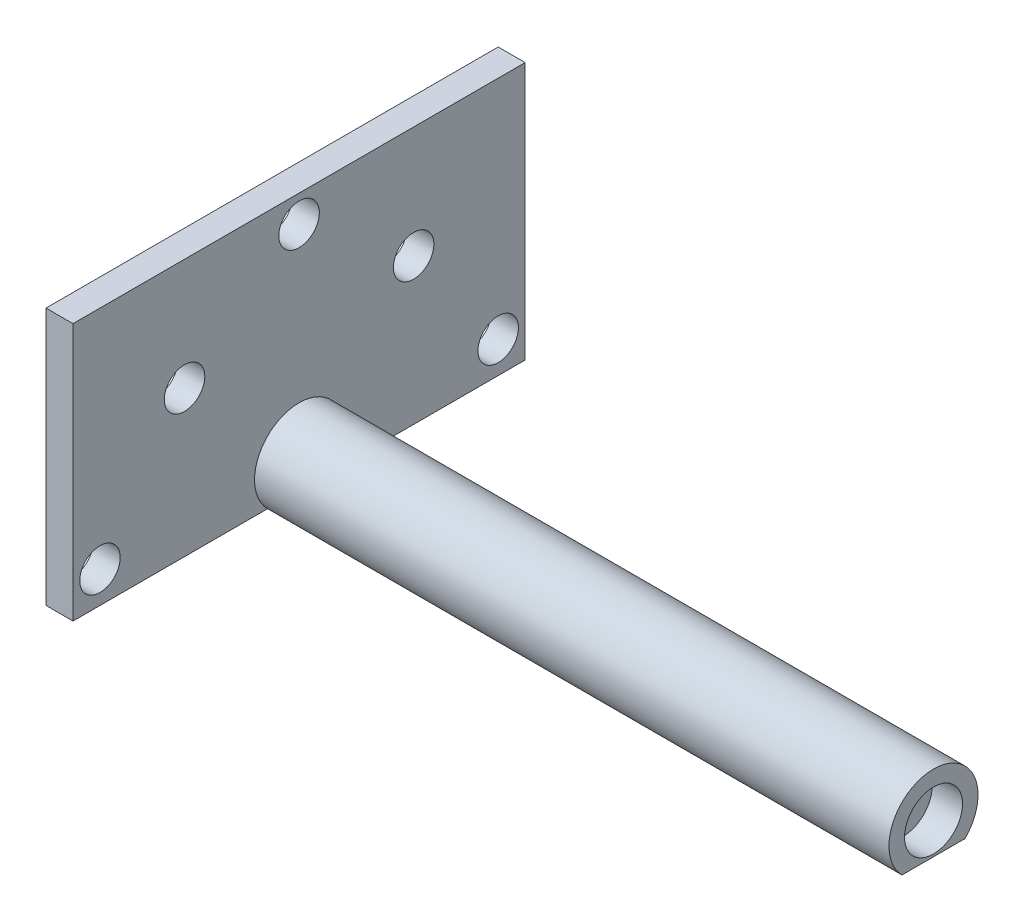
ISO-10303-21;
HEADER;
FILE_DESCRIPTION(('STEP AP214'),'2;1');
FILE_NAME('part.step','',(''),(''),'','','');
FILE_SCHEMA(('AUTOMOTIVE_DESIGN { 1 0 10303 214 1 1 1 1 }'));
ENDSEC;
DATA;
#1=APPLICATION_CONTEXT('core data for automotive mechanical design processes');
#2=APPLICATION_PROTOCOL_DEFINITION('international standard','automotive_design',2000,#1);
#3=PRODUCT_CONTEXT('',#1,'mechanical');
#4=PRODUCT('Part','Part','',(#3));
#5=PRODUCT_RELATED_PRODUCT_CATEGORY('part','',(#4));
#6=PRODUCT_DEFINITION_FORMATION('','',#4);
#7=PRODUCT_DEFINITION_CONTEXT('part definition',#1,'design');
#8=PRODUCT_DEFINITION('design','',#6,#7);
#9=PRODUCT_DEFINITION_SHAPE('','',#8);
#10=(LENGTH_UNIT() NAMED_UNIT(*) SI_UNIT(.MILLI.,.METRE.));
#11=(NAMED_UNIT(*) PLANE_ANGLE_UNIT() SI_UNIT($,.RADIAN.));
#12=(NAMED_UNIT(*) SI_UNIT($,.STERADIAN.) SOLID_ANGLE_UNIT());
#13=UNCERTAINTY_MEASURE_WITH_UNIT(LENGTH_MEASURE(1.E-05),#10,'distance_accuracy_value','');
#14=(GEOMETRIC_REPRESENTATION_CONTEXT(3) GLOBAL_UNCERTAINTY_ASSIGNED_CONTEXT((#13)) GLOBAL_UNIT_ASSIGNED_CONTEXT((#10,
#11,#12)) REPRESENTATION_CONTEXT('',''));
#15=CARTESIAN_POINT('',(0.,0.,0.));
#16=DIRECTION('',(0.,0.,1.));
#17=DIRECTION('',(1.,0.,0.));
#18=AXIS2_PLACEMENT_3D('',#15,#16,#17);
#19=CARTESIAN_POINT('',(2.,0.,16.75));
#20=DIRECTION('',(0.,0.,1.));
#21=DIRECTION('',(1.,0.,0.));
#22=AXIS2_PLACEMENT_3D('',#19,#20,#21);
#23=PLANE('',#22);
#24=DIRECTION('',(0.,1.,0.));
#25=VECTOR('',#24,1.);
#26=CARTESIAN_POINT('',(0.,0.,16.75));
#27=LINE('',#26,#25);
#28=CARTESIAN_POINT('',(0.,-2.33345237791561,16.75));
#29=VERTEX_POINT('',#28);
#30=CARTESIAN_POINT('',(0.,16.75,16.75));
#31=VERTEX_POINT('',#30);
#32=EDGE_CURVE('E114',#29,#31,#27,.T.);
#33=ORIENTED_EDGE('',*,*,#32,.F.);
#34=DIRECTION('',(-1.,0.,0.));
#35=VECTOR('',#34,1.);
#36=CARTESIAN_POINT('',(2.,-2.33345237791561,16.75));
#37=LINE('',#36,#35);
#38=CARTESIAN_POINT('',(2.,-2.33345237791561,16.75));
#39=VERTEX_POINT('',#38);
#40=EDGE_CURVE('E11',#39,#29,#37,.T.);
#41=ORIENTED_EDGE('',*,*,#40,.F.);
#42=DIRECTION('',(0.,1.,0.));
#43=VECTOR('',#42,1.);
#44=CARTESIAN_POINT('',(2.,0.,16.75));
#45=LINE('',#44,#43);
#46=CARTESIAN_POINT('',(2.,16.75,16.75));
#47=VERTEX_POINT('',#46);
#48=EDGE_CURVE('E118',#39,#47,#45,.T.);
#49=ORIENTED_EDGE('',*,*,#48,.T.);
#50=DIRECTION('',(-1.,0.,0.));
#51=VECTOR('',#50,1.);
#52=CARTESIAN_POINT('',(2.,16.75,16.75));
#53=LINE('',#52,#51);
#54=EDGE_CURVE('E64',#47,#31,#53,.T.);
#55=ORIENTED_EDGE('',*,*,#54,.T.);
#56=EDGE_LOOP('',(#33,#41,#49,#55));
#57=FACE_BOUND('',#56,.T.);
#58=ADVANCED_FACE('F41',(#57),#23,.T.);
#59=CARTESIAN_POINT('',(2.,-2.33345237791561,0.));
#60=DIRECTION('',(0.,1.,0.));
#61=DIRECTION('',(0.,0.,1.));
#62=AXIS2_PLACEMENT_3D('',#59,#60,#61);
#63=PLANE('',#62);
#64=DIRECTION('',(0.,0.,-1.));
#65=VECTOR('',#64,1.);
#66=CARTESIAN_POINT('',(0.,-2.33345237791561,0.));
#67=LINE('',#66,#65);
#68=CARTESIAN_POINT('',(0.,-2.33345237791561,-16.75));
#69=VERTEX_POINT('',#68);
#70=EDGE_CURVE('E144',#29,#69,#67,.T.);
#71=ORIENTED_EDGE('',*,*,#70,.T.);
#72=DIRECTION('',(-1.,0.,0.));
#73=VECTOR('',#72,1.);
#74=CARTESIAN_POINT('',(2.,-2.33345237791561,-16.75));
#75=LINE('',#74,#73);
#76=CARTESIAN_POINT('',(2.,-2.33345237791561,-16.75));
#77=VERTEX_POINT('',#76);
#78=EDGE_CURVE('E48',#77,#69,#75,.T.);
#79=ORIENTED_EDGE('',*,*,#78,.F.);
#80=DIRECTION('',(0.,0.,-1.));
#81=VECTOR('',#80,1.);
#82=CARTESIAN_POINT('',(2.,-2.33345237791561,0.));
#83=LINE('',#82,#81);
#84=CARTESIAN_POINT('',(2.,-2.33345237791561,-2.33345237791561));
#85=VERTEX_POINT('',#84);
#86=EDGE_CURVE('E111',#85,#77,#83,.T.);
#87=ORIENTED_EDGE('',*,*,#86,.F.);
#88=DIRECTION('',(-1.,0.,0.));
#89=VECTOR('',#88,1.);
#90=CARTESIAN_POINT('',(49.,-2.33345237791561,-2.33345237791561));
#91=LINE('',#90,#89);
#92=CARTESIAN_POINT('',(49.,-2.33345237791561,-2.33345237791561));
#93=VERTEX_POINT('',#92);
#94=EDGE_CURVE('E55',#93,#85,#91,.T.);
#95=ORIENTED_EDGE('',*,*,#94,.F.);
#96=DIRECTION('',(0.,0.,-1.));
#97=VECTOR('',#96,1.);
#98=CARTESIAN_POINT('',(49.,-2.33345237791561,0.));
#99=LINE('',#98,#97);
#100=CARTESIAN_POINT('',(49.,-2.33345237791561,2.33345237791561));
#101=VERTEX_POINT('',#100);
#102=EDGE_CURVE('E102',#101,#93,#99,.T.);
#103=ORIENTED_EDGE('',*,*,#102,.F.);
#104=DIRECTION('',(-1.,0.,0.));
#105=VECTOR('',#104,1.);
#106=CARTESIAN_POINT('',(49.,-2.33345237791561,2.33345237791561));
#107=LINE('',#106,#105);
#108=CARTESIAN_POINT('',(2.,-2.33345237791561,2.33345237791561));
#109=VERTEX_POINT('',#108);
#110=EDGE_CURVE('E99',#101,#109,#107,.T.);
#111=ORIENTED_EDGE('',*,*,#110,.T.);
#112=EDGE_CURVE('E121',#39,#109,#83,.T.);
#113=ORIENTED_EDGE('',*,*,#112,.F.);
#114=ORIENTED_EDGE('',*,*,#40,.T.);
#115=EDGE_LOOP('',(#71,#79,#87,#95,#103,#111,#113,#114));
#116=FACE_BOUND('',#115,.T.);
#117=ADVANCED_FACE('F109',(#116),#63,.F.);
#118=CARTESIAN_POINT('',(2.,0.,-16.75));
#119=DIRECTION('',(0.,0.,1.));
#120=DIRECTION('',(0.,-1.,0.));
#121=AXIS2_PLACEMENT_3D('',#118,#119,#120);
#122=PLANE('',#121);
#123=DIRECTION('',(0.,1.,0.));
#124=VECTOR('',#123,1.);
#125=CARTESIAN_POINT('',(0.,0.,-16.75));
#126=LINE('',#125,#124);
#127=CARTESIAN_POINT('',(0.,16.75,-16.75));
#128=VERTEX_POINT('',#127);
#129=EDGE_CURVE('E146',#69,#128,#126,.T.);
#130=ORIENTED_EDGE('',*,*,#129,.T.);
#131=DIRECTION('',(-1.,0.,0.));
#132=VECTOR('',#131,1.);
#133=CARTESIAN_POINT('',(2.,16.75,-16.75));
#134=LINE('',#133,#132);
#135=CARTESIAN_POINT('',(2.,16.75,-16.75));
#136=VERTEX_POINT('',#135);
#137=EDGE_CURVE('E167',#136,#128,#134,.T.);
#138=ORIENTED_EDGE('',*,*,#137,.F.);
#139=DIRECTION('',(0.,1.,0.));
#140=VECTOR('',#139,1.);
#141=CARTESIAN_POINT('',(2.,0.,-16.75));
#142=LINE('',#141,#140);
#143=EDGE_CURVE('E124',#77,#136,#142,.T.);
#144=ORIENTED_EDGE('',*,*,#143,.F.);
#145=ORIENTED_EDGE('',*,*,#78,.T.);
#146=EDGE_LOOP('',(#130,#138,#144,#145));
#147=FACE_BOUND('',#146,.T.);
#148=ADVANCED_FACE('F172',(#147),#122,.F.);
#149=CARTESIAN_POINT('',(2.,0.,-14.75));
#150=DIRECTION('',(-1.,0.,0.));
#151=DIRECTION('',(0.,0.,1.));
#152=AXIS2_PLACEMENT_3D('',#149,#150,#151);
#153=CYLINDRICAL_SURFACE('',#152,1.5);
#154=CARTESIAN_POINT('',(2.,0.,-14.75));
#155=DIRECTION('',(1.,0.,0.));
#156=DIRECTION('',(0.,0.,-1.));
#157=AXIS2_PLACEMENT_3D('',#154,#155,#156);
#158=CIRCLE('',#157,1.5);
#159=CARTESIAN_POINT('',(2.,0.,-16.25));
#160=VERTEX_POINT('',#159);
#161=EDGE_CURVE('E137',#160,#160,#158,.T.);
#162=ORIENTED_EDGE('',*,*,#161,.T.);
#163=EDGE_LOOP('',(#162));
#164=FACE_BOUND('',#163,.T.);
#165=CARTESIAN_POINT('',(0.,0.,-14.75));
#166=DIRECTION('',(1.,0.,0.));
#167=DIRECTION('',(0.,0.,-1.));
#168=AXIS2_PLACEMENT_3D('',#165,#166,#167);
#169=CIRCLE('',#168,1.5);
#170=CARTESIAN_POINT('',(0.,0.,-16.25));
#171=VERTEX_POINT('',#170);
#172=EDGE_CURVE('E161',#171,#171,#169,.T.);
#173=ORIENTED_EDGE('',*,*,#172,.F.);
#174=EDGE_LOOP('',(#173));
#175=FACE_BOUND('',#174,.T.);
#176=ADVANCED_FACE('F193',(#164,#175),#153,.F.);
#177=CARTESIAN_POINT('',(2.,0.,14.75));
#178=DIRECTION('',(-1.,0.,0.));
#179=DIRECTION('',(0.,0.,1.));
#180=AXIS2_PLACEMENT_3D('',#177,#178,#179);
#181=CYLINDRICAL_SURFACE('',#180,1.5);
#182=CARTESIAN_POINT('',(2.,0.,14.75));
#183=DIRECTION('',(1.,0.,0.));
#184=DIRECTION('',(0.,0.,-1.));
#185=AXIS2_PLACEMENT_3D('',#182,#183,#184);
#186=CIRCLE('',#185,1.5);
#187=CARTESIAN_POINT('',(2.,0.,13.25));
#188=VERTEX_POINT('',#187);
#189=EDGE_CURVE('E134',#188,#188,#186,.T.);
#190=ORIENTED_EDGE('',*,*,#189,.T.);
#191=EDGE_LOOP('',(#190));
#192=FACE_BOUND('',#191,.T.);
#193=CARTESIAN_POINT('',(0.,0.,14.75));
#194=DIRECTION('',(1.,0.,0.));
#195=DIRECTION('',(0.,0.,-1.));
#196=AXIS2_PLACEMENT_3D('',#193,#194,#195);
#197=CIRCLE('',#196,1.5);
#198=CARTESIAN_POINT('',(0.,0.,13.25));
#199=VERTEX_POINT('',#198);
#200=EDGE_CURVE('E158',#199,#199,#197,.T.);
#201=ORIENTED_EDGE('',*,*,#200,.F.);
#202=EDGE_LOOP('',(#201));
#203=FACE_BOUND('',#202,.T.);
#204=ADVANCED_FACE('F206',(#192,#203),#181,.F.);
#205=CARTESIAN_POINT('',(2.,8.48528137423857,8.48528137423857));
#206=DIRECTION('',(-1.,0.,0.));
#207=DIRECTION('',(0.,0.,1.));
#208=AXIS2_PLACEMENT_3D('',#205,#206,#207);
#209=CYLINDRICAL_SURFACE('',#208,1.5);
#210=CARTESIAN_POINT('',(2.,8.48528137423857,8.48528137423857));
#211=DIRECTION('',(1.,0.,0.));
#212=DIRECTION('',(0.,0.,-1.));
#213=AXIS2_PLACEMENT_3D('',#210,#211,#212);
#214=CIRCLE('',#213,1.5);
#215=CARTESIAN_POINT('',(2.,8.48528137423857,6.98528137423857));
#216=VERTEX_POINT('',#215);
#217=EDGE_CURVE('E131',#216,#216,#214,.T.);
#218=ORIENTED_EDGE('',*,*,#217,.T.);
#219=EDGE_LOOP('',(#218));
#220=FACE_BOUND('',#219,.T.);
#221=CARTESIAN_POINT('',(0.,8.48528137423857,8.48528137423857));
#222=DIRECTION('',(1.,0.,0.));
#223=DIRECTION('',(0.,0.,-1.));
#224=AXIS2_PLACEMENT_3D('',#221,#222,#223);
#225=CIRCLE('',#224,1.5);
#226=CARTESIAN_POINT('',(0.,8.48528137423857,6.98528137423857));
#227=VERTEX_POINT('',#226);
#228=EDGE_CURVE('E155',#227,#227,#225,.T.);
#229=ORIENTED_EDGE('',*,*,#228,.F.);
#230=EDGE_LOOP('',(#229));
#231=FACE_BOUND('',#230,.T.);
#232=ADVANCED_FACE('F202',(#220,#231),#209,.F.);
#233=CARTESIAN_POINT('',(2.,8.48528137423854,-8.4852813742386));
#234=DIRECTION('',(-1.,0.,0.));
#235=DIRECTION('',(0.,0.,1.));
#236=AXIS2_PLACEMENT_3D('',#233,#234,#235);
#237=CYLINDRICAL_SURFACE('',#236,1.5);
#238=CARTESIAN_POINT('',(2.,8.48528137423854,-8.4852813742386));
#239=DIRECTION('',(1.,0.,0.));
#240=DIRECTION('',(0.,0.,-1.));
#241=AXIS2_PLACEMENT_3D('',#238,#239,#240);
#242=CIRCLE('',#241,1.5);
#243=CARTESIAN_POINT('',(2.,8.48528137423854,-9.9852813742386));
#244=VERTEX_POINT('',#243);
#245=EDGE_CURVE('E128',#244,#244,#242,.T.);
#246=ORIENTED_EDGE('',*,*,#245,.T.);
#247=EDGE_LOOP('',(#246));
#248=FACE_BOUND('',#247,.T.);
#249=CARTESIAN_POINT('',(0.,8.48528137423854,-8.4852813742386));
#250=DIRECTION('',(1.,0.,0.));
#251=DIRECTION('',(0.,0.,-1.));
#252=AXIS2_PLACEMENT_3D('',#249,#250,#251);
#253=CIRCLE('',#252,1.5);
#254=CARTESIAN_POINT('',(0.,8.48528137423854,-9.9852813742386));
#255=VERTEX_POINT('',#254);
#256=EDGE_CURVE('E152',#255,#255,#253,.T.);
#257=ORIENTED_EDGE('',*,*,#256,.F.);
#258=EDGE_LOOP('',(#257));
#259=FACE_BOUND('',#258,.T.);
#260=ADVANCED_FACE('F199',(#248,#259),#237,.F.);
#261=CARTESIAN_POINT('',(2.,16.75,0.));
#262=DIRECTION('',(0.,1.,0.));
#263=DIRECTION('',(0.,0.,1.));
#264=AXIS2_PLACEMENT_3D('',#261,#262,#263);
#265=PLANE('',#264);
#266=DIRECTION('',(0.,0.,-1.));
#267=VECTOR('',#266,1.);
#268=CARTESIAN_POINT('',(0.,16.75,0.));
#269=LINE('',#268,#267);
#270=EDGE_CURVE('E149',#31,#128,#269,.T.);
#271=ORIENTED_EDGE('',*,*,#270,.F.);
#272=ORIENTED_EDGE('',*,*,#54,.F.);
#273=DIRECTION('',(0.,0.,-1.));
#274=VECTOR('',#273,1.);
#275=CARTESIAN_POINT('',(2.,16.75,0.));
#276=LINE('',#275,#274);
#277=EDGE_CURVE('E126',#47,#136,#276,.T.);
#278=ORIENTED_EDGE('',*,*,#277,.T.);
#279=ORIENTED_EDGE('',*,*,#137,.T.);
#280=EDGE_LOOP('',(#271,#272,#278,#279));
#281=FACE_BOUND('',#280,.T.);
#282=ADVANCED_FACE('F178',(#281),#265,.T.);
#283=CARTESIAN_POINT('',(2.,14.75,0.));
#284=DIRECTION('',(-1.,0.,0.));
#285=DIRECTION('',(0.,0.,1.));
#286=AXIS2_PLACEMENT_3D('',#283,#284,#285);
#287=CYLINDRICAL_SURFACE('',#286,1.5);
#288=CARTESIAN_POINT('',(2.,14.75,0.));
#289=DIRECTION('',(1.,0.,0.));
#290=DIRECTION('',(0.,0.,-1.));
#291=AXIS2_PLACEMENT_3D('',#288,#289,#290);
#292=CIRCLE('',#291,1.5);
#293=CARTESIAN_POINT('',(2.,14.75,-1.5));
#294=VERTEX_POINT('',#293);
#295=EDGE_CURVE('E140',#294,#294,#292,.T.);
#296=ORIENTED_EDGE('',*,*,#295,.T.);
#297=EDGE_LOOP('',(#296));
#298=FACE_BOUND('',#297,.T.);
#299=CARTESIAN_POINT('',(0.,14.75,0.));
#300=DIRECTION('',(1.,0.,0.));
#301=DIRECTION('',(0.,0.,-1.));
#302=AXIS2_PLACEMENT_3D('',#299,#300,#301);
#303=CIRCLE('',#302,1.5);
#304=CARTESIAN_POINT('',(0.,14.75,-1.5));
#305=VERTEX_POINT('',#304);
#306=EDGE_CURVE('E120',#305,#305,#303,.T.);
#307=ORIENTED_EDGE('',*,*,#306,.F.);
#308=EDGE_LOOP('',(#307));
#309=FACE_BOUND('',#308,.T.);
#310=ADVANCED_FACE('F198',(#298,#309),#287,.F.);
#311=CARTESIAN_POINT('',(2.,0.,0.));
#312=DIRECTION('',(1.,0.,0.));
#313=DIRECTION('',(0.,0.,-1.));
#314=AXIS2_PLACEMENT_3D('',#311,#312,#313);
#315=PLANE('',#314);
#316=ORIENTED_EDGE('',*,*,#112,.T.);
#317=CARTESIAN_POINT('',(2.,0.,0.));
#318=DIRECTION('',(1.,0.,0.));
#319=DIRECTION('',(0.,0.,-1.));
#320=AXIS2_PLACEMENT_3D('',#317,#318,#319);
#321=CIRCLE('',#320,3.3);
#322=EDGE_CURVE('E112',#109,#85,#321,.F.);
#323=ORIENTED_EDGE('',*,*,#322,.T.);
#324=ORIENTED_EDGE('',*,*,#86,.T.);
#325=ORIENTED_EDGE('',*,*,#143,.T.);
#326=ORIENTED_EDGE('',*,*,#277,.F.);
#327=ORIENTED_EDGE('',*,*,#48,.F.);
#328=EDGE_LOOP('',(#316,#323,#324,#325,#326,#327));
#329=FACE_BOUND('',#328,.T.);
#330=ORIENTED_EDGE('',*,*,#245,.F.);
#331=EDGE_LOOP('',(#330));
#332=FACE_BOUND('',#331,.T.);
#333=ORIENTED_EDGE('',*,*,#217,.F.);
#334=EDGE_LOOP('',(#333));
#335=FACE_BOUND('',#334,.T.);
#336=ORIENTED_EDGE('',*,*,#189,.F.);
#337=EDGE_LOOP('',(#336));
#338=FACE_BOUND('',#337,.T.);
#339=ORIENTED_EDGE('',*,*,#161,.F.);
#340=EDGE_LOOP('',(#339));
#341=FACE_BOUND('',#340,.T.);
#342=ORIENTED_EDGE('',*,*,#295,.F.);
#343=EDGE_LOOP('',(#342));
#344=FACE_BOUND('',#343,.T.);
#345=ADVANCED_FACE('F182',(#329,#332,#335,#338,#341,#344),#315,.T.);
#346=CARTESIAN_POINT('',(0.,0.,0.));
#347=DIRECTION('',(1.,0.,0.));
#348=DIRECTION('',(0.,0.,-1.));
#349=AXIS2_PLACEMENT_3D('',#346,#347,#348);
#350=PLANE('',#349);
#351=ORIENTED_EDGE('',*,*,#129,.F.);
#352=ORIENTED_EDGE('',*,*,#70,.F.);
#353=ORIENTED_EDGE('',*,*,#32,.T.);
#354=ORIENTED_EDGE('',*,*,#270,.T.);
#355=EDGE_LOOP('',(#351,#352,#353,#354));
#356=FACE_BOUND('',#355,.T.);
#357=ORIENTED_EDGE('',*,*,#256,.T.);
#358=EDGE_LOOP('',(#357));
#359=FACE_BOUND('',#358,.T.);
#360=ORIENTED_EDGE('',*,*,#228,.T.);
#361=EDGE_LOOP('',(#360));
#362=FACE_BOUND('',#361,.T.);
#363=ORIENTED_EDGE('',*,*,#200,.T.);
#364=EDGE_LOOP('',(#363));
#365=FACE_BOUND('',#364,.T.);
#366=ORIENTED_EDGE('',*,*,#172,.T.);
#367=EDGE_LOOP('',(#366));
#368=FACE_BOUND('',#367,.T.);
#369=ORIENTED_EDGE('',*,*,#306,.T.);
#370=EDGE_LOOP('',(#369));
#371=FACE_BOUND('',#370,.T.);
#372=ADVANCED_FACE('F176',(#356,#359,#362,#365,#368,#371),#350,.F.);
#373=CARTESIAN_POINT('',(49.,0.,0.));
#374=DIRECTION('',(-1.,0.,0.));
#375=DIRECTION('',(0.,0.,1.));
#376=AXIS2_PLACEMENT_3D('',#373,#374,#375);
#377=CYLINDRICAL_SURFACE('',#376,3.3);
#378=ORIENTED_EDGE('',*,*,#322,.F.);
#379=ORIENTED_EDGE('',*,*,#110,.F.);
#380=CARTESIAN_POINT('',(49.,0.,0.));
#381=DIRECTION('',(1.,0.,0.));
#382=DIRECTION('',(0.,0.,-1.));
#383=AXIS2_PLACEMENT_3D('',#380,#381,#382);
#384=CIRCLE('',#383,3.3);
#385=EDGE_CURVE('E95',#93,#101,#384,.T.);
#386=ORIENTED_EDGE('',*,*,#385,.F.);
#387=ORIENTED_EDGE('',*,*,#94,.T.);
#388=EDGE_LOOP('',(#378,#379,#386,#387));
#389=FACE_BOUND('',#388,.T.);
#390=ADVANCED_FACE('F97',(#389),#377,.T.);
#391=CARTESIAN_POINT('',(49.,0.,0.));
#392=DIRECTION('',(1.,0.,0.));
#393=DIRECTION('',(0.,0.,-1.));
#394=AXIS2_PLACEMENT_3D('',#391,#392,#393);
#395=PLANE('',#394);
#396=CARTESIAN_POINT('',(49.,0.,0.));
#397=DIRECTION('',(1.,0.,0.));
#398=DIRECTION('',(0.,0.,-1.));
#399=AXIS2_PLACEMENT_3D('',#396,#397,#398);
#400=CIRCLE('',#399,2.15);
#401=CARTESIAN_POINT('',(49.,0.,-2.15));
#402=VERTEX_POINT('',#401);
#403=EDGE_CURVE('E235',#402,#402,#400,.T.);
#404=ORIENTED_EDGE('',*,*,#403,.F.);
#405=EDGE_LOOP('',(#404));
#406=FACE_BOUND('',#405,.T.);
#407=ORIENTED_EDGE('',*,*,#102,.T.);
#408=ORIENTED_EDGE('',*,*,#385,.T.);
#409=EDGE_LOOP('',(#407,#408));
#410=FACE_BOUND('',#409,.T.);
#411=ADVANCED_FACE('F104',(#406,#410),#395,.T.);
#412=CARTESIAN_POINT('',(46.75,0.,0.));
#413=DIRECTION('',(1.,0.,0.));
#414=DIRECTION('',(0.,0.,-1.));
#415=AXIS2_PLACEMENT_3D('',#412,#413,#414);
#416=CYLINDRICAL_SURFACE('',#415,2.15);
#417=CARTESIAN_POINT('',(46.75,0.,0.));
#418=DIRECTION('',(1.,0.,0.));
#419=DIRECTION('',(0.,0.,-1.));
#420=AXIS2_PLACEMENT_3D('',#417,#418,#419);
#421=CIRCLE('',#420,2.15);
#422=CARTESIAN_POINT('',(46.75,0.,-2.15));
#423=VERTEX_POINT('',#422);
#424=EDGE_CURVE('E106',#423,#423,#421,.T.);
#425=ORIENTED_EDGE('',*,*,#424,.F.);
#426=EDGE_LOOP('',(#425));
#427=FACE_BOUND('',#426,.T.);
#428=ORIENTED_EDGE('',*,*,#403,.T.);
#429=EDGE_LOOP('',(#428));
#430=FACE_BOUND('',#429,.T.);
#431=ADVANCED_FACE('F223',(#427,#430),#416,.F.);
#432=CARTESIAN_POINT('',(46.75,0.,0.));
#433=DIRECTION('',(1.,0.,0.));
#434=DIRECTION('',(0.,0.,-1.));
#435=AXIS2_PLACEMENT_3D('',#432,#433,#434);
#436=PLANE('',#435);
#437=ORIENTED_EDGE('',*,*,#424,.T.);
#438=EDGE_LOOP('',(#437));
#439=FACE_BOUND('',#438,.T.);
#440=ADVANCED_FACE('F227',(#439),#436,.T.);
#441=CLOSED_SHELL('',(#58,#117,#148,#176,#204,#232,#260,#282,#310,#345,#372,#390,#411,#431,#440));
#442=MANIFOLD_SOLID_BREP('B2',#441);
#443=ADVANCED_BREP_SHAPE_REPRESENTATION('',(#18,#442),#14);
#444=SHAPE_DEFINITION_REPRESENTATION(#9,#443);
ENDSEC;
END-ISO-10303-21;
